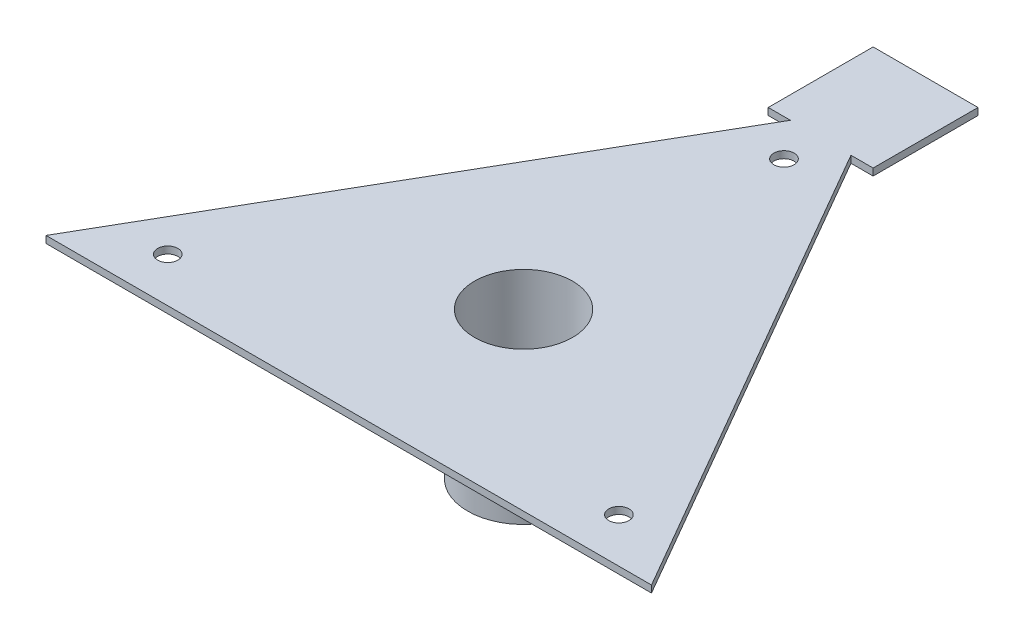
ISO-10303-21;
HEADER;
FILE_DESCRIPTION(('STEP AP214'),'2;1');
FILE_NAME('part.step','',(''),(''),'','','');
FILE_SCHEMA(('AUTOMOTIVE_DESIGN { 1 0 10303 214 1 1 1 1 }'));
ENDSEC;
DATA;
#1=APPLICATION_CONTEXT('core data for automotive mechanical design processes');
#2=APPLICATION_PROTOCOL_DEFINITION('international standard','automotive_design',2000,#1);
#3=PRODUCT_CONTEXT('',#1,'mechanical');
#4=PRODUCT('Part','Part','',(#3));
#5=PRODUCT_RELATED_PRODUCT_CATEGORY('part','',(#4));
#6=PRODUCT_DEFINITION_FORMATION('','',#4);
#7=PRODUCT_DEFINITION_CONTEXT('part definition',#1,'design');
#8=PRODUCT_DEFINITION('design','',#6,#7);
#9=PRODUCT_DEFINITION_SHAPE('','',#8);
#10=(LENGTH_UNIT() NAMED_UNIT(*) SI_UNIT(.MILLI.,.METRE.));
#11=(NAMED_UNIT(*) PLANE_ANGLE_UNIT() SI_UNIT($,.RADIAN.));
#12=(NAMED_UNIT(*) SI_UNIT($,.STERADIAN.) SOLID_ANGLE_UNIT());
#13=UNCERTAINTY_MEASURE_WITH_UNIT(LENGTH_MEASURE(1.E-05),#10,'distance_accuracy_value','');
#14=(GEOMETRIC_REPRESENTATION_CONTEXT(3) GLOBAL_UNCERTAINTY_ASSIGNED_CONTEXT((#13)) GLOBAL_UNIT_ASSIGNED_CONTEXT((#10,
#11,#12)) REPRESENTATION_CONTEXT('',''));
#15=CARTESIAN_POINT('',(0.,0.,0.));
#16=DIRECTION('',(0.,0.,1.));
#17=DIRECTION('',(1.,0.,0.));
#18=AXIS2_PLACEMENT_3D('',#15,#16,#17);
#19=CARTESIAN_POINT('',(-21.650635094611,1.25,-12.5));
#20=DIRECTION('',(0.866025403784439,0.,0.5));
#21=DIRECTION('',(0.5,0.,-0.866025403784439));
#22=AXIS2_PLACEMENT_3D('',#19,#20,#21);
#23=PLANE('',#22);
#24=DIRECTION('',(-0.5,0.,0.866025403784439));
#25=VECTOR('',#24,1.);
#26=CARTESIAN_POINT('',(-21.650635094611,1.,-12.5));
#27=LINE('',#26,#25);
#28=CARTESIAN_POINT('',(-4.33012701892221,1.,-42.5));
#29=VERTEX_POINT('',#28);
#30=CARTESIAN_POINT('',(-43.3012701892219,1.,25.));
#31=VERTEX_POINT('',#30);
#32=EDGE_CURVE('E170',#29,#31,#27,.T.);
#33=ORIENTED_EDGE('',*,*,#32,.F.);
#34=DIRECTION('',(0.,-1.,0.));
#35=VECTOR('',#34,1.);
#36=CARTESIAN_POINT('',(-4.33012701892221,1.25,-42.5));
#37=LINE('',#36,#35);
#38=CARTESIAN_POINT('',(-4.33012701892221,0.,-42.5));
#39=VERTEX_POINT('',#38);
#40=EDGE_CURVE('E155',#29,#39,#37,.T.);
#41=ORIENTED_EDGE('',*,*,#40,.T.);
#42=DIRECTION('',(-0.5,0.,0.866025403784439));
#43=VECTOR('',#42,1.);
#44=CARTESIAN_POINT('',(-21.650635094611,0.,-12.5));
#45=LINE('',#44,#43);
#46=CARTESIAN_POINT('',(-43.3012701892219,0.,25.));
#47=VERTEX_POINT('',#46);
#48=EDGE_CURVE('E182',#39,#47,#45,.T.);
#49=ORIENTED_EDGE('',*,*,#48,.T.);
#50=DIRECTION('',(0.,-1.,0.));
#51=VECTOR('',#50,1.);
#52=CARTESIAN_POINT('',(-43.3012701892219,1.25,25.));
#53=LINE('',#52,#51);
#54=EDGE_CURVE('E52',#31,#47,#53,.T.);
#55=ORIENTED_EDGE('',*,*,#54,.F.);
#56=EDGE_LOOP('',(#33,#41,#49,#55));
#57=FACE_BOUND('',#56,.T.);
#58=ADVANCED_FACE('F44',(#57),#23,.F.);
#59=CARTESIAN_POINT('',(0.,1.25,25.));
#60=DIRECTION('',(0.,0.,-1.));
#61=DIRECTION('',(-1.,0.,0.));
#62=AXIS2_PLACEMENT_3D('',#59,#60,#61);
#63=PLANE('',#62);
#64=DIRECTION('',(1.,0.,0.));
#65=VECTOR('',#64,1.);
#66=CARTESIAN_POINT('',(0.,1.,25.));
#67=LINE('',#66,#65);
#68=CARTESIAN_POINT('',(43.3012701892219,1.,25.0000000000001));
#69=VERTEX_POINT('',#68);
#70=EDGE_CURVE('E168',#31,#69,#67,.T.);
#71=ORIENTED_EDGE('',*,*,#70,.F.);
#72=ORIENTED_EDGE('',*,*,#54,.T.);
#73=DIRECTION('',(1.,0.,0.));
#74=VECTOR('',#73,1.);
#75=CARTESIAN_POINT('',(0.,0.,25.));
#76=LINE('',#75,#74);
#77=CARTESIAN_POINT('',(43.3012701892219,0.,25.0000000000001));
#78=VERTEX_POINT('',#77);
#79=EDGE_CURVE('E189',#47,#78,#76,.T.);
#80=ORIENTED_EDGE('',*,*,#79,.T.);
#81=DIRECTION('',(0.,-1.,0.));
#82=VECTOR('',#81,1.);
#83=CARTESIAN_POINT('',(43.3012701892219,1.25,25.0000000000001));
#84=LINE('',#83,#82);
#85=EDGE_CURVE('E194',#69,#78,#84,.T.);
#86=ORIENTED_EDGE('',*,*,#85,.F.);
#87=EDGE_LOOP('',(#71,#72,#80,#86));
#88=FACE_BOUND('',#87,.T.);
#89=ADVANCED_FACE('F201',(#88),#63,.F.);
#90=CARTESIAN_POINT('',(21.6506350946109,1.25,-12.5));
#91=DIRECTION('',(0.866025403784439,0.,-0.499999999999999));
#92=DIRECTION('',(-0.499999999999999,0.,-0.866025403784439));
#93=AXIS2_PLACEMENT_3D('',#90,#91,#92);
#94=PLANE('',#93);
#95=DIRECTION('',(0.,-1.,0.));
#96=VECTOR('',#95,1.);
#97=CARTESIAN_POINT('',(4.3301270189222,1.25,-42.5));
#98=LINE('',#97,#96);
#99=CARTESIAN_POINT('',(4.33012701892219,1.,-42.5));
#100=VERTEX_POINT('',#99);
#101=CARTESIAN_POINT('',(4.33012701892219,0.,-42.5));
#102=VERTEX_POINT('',#101);
#103=EDGE_CURVE('E149',#100,#102,#98,.T.);
#104=ORIENTED_EDGE('',*,*,#103,.F.);
#105=DIRECTION('',(0.499999999999999,0.,0.866025403784439));
#106=VECTOR('',#105,1.);
#107=CARTESIAN_POINT('',(21.6506350946109,1.,-12.5));
#108=LINE('',#107,#106);
#109=EDGE_CURVE('E67',#100,#69,#108,.T.);
#110=ORIENTED_EDGE('',*,*,#109,.T.);
#111=ORIENTED_EDGE('',*,*,#85,.T.);
#112=DIRECTION('',(0.499999999999999,0.,0.866025403784439));
#113=VECTOR('',#112,1.);
#114=CARTESIAN_POINT('',(21.6506350946109,0.,-12.5));
#115=LINE('',#114,#113);
#116=EDGE_CURVE('E192',#102,#78,#115,.T.);
#117=ORIENTED_EDGE('',*,*,#116,.F.);
#118=EDGE_LOOP('',(#104,#110,#111,#117));
#119=FACE_BOUND('',#118,.T.);
#120=ADVANCED_FACE('F209',(#119),#94,.T.);
#121=CARTESIAN_POINT('',(32.2594462909703,0.,18.625));
#122=DIRECTION('',(0.,1.,0.));
#123=DIRECTION('',(0.,0.,1.));
#124=AXIS2_PLACEMENT_3D('',#121,#122,#123);
#125=CYLINDRICAL_SURFACE('',#124,1.45);
#126=CARTESIAN_POINT('',(32.2594462909703,0.,18.625));
#127=DIRECTION('',(0.,1.,0.));
#128=DIRECTION('',(0.,0.,1.));
#129=AXIS2_PLACEMENT_3D('',#126,#127,#128);
#130=CIRCLE('',#129,1.45);
#131=CARTESIAN_POINT('',(32.2594462909703,0.,20.075));
#132=VERTEX_POINT('',#131);
#133=EDGE_CURVE('E178',#132,#132,#130,.T.);
#134=ORIENTED_EDGE('',*,*,#133,.F.);
#135=EDGE_LOOP('',(#134));
#136=FACE_BOUND('',#135,.T.);
#137=CARTESIAN_POINT('',(32.2594462909703,1.,18.625));
#138=DIRECTION('',(0.,1.,0.));
#139=DIRECTION('',(0.,0.,1.));
#140=AXIS2_PLACEMENT_3D('',#137,#138,#139);
#141=CIRCLE('',#140,1.45);
#142=CARTESIAN_POINT('',(32.2594462909703,1.,20.075));
#143=VERTEX_POINT('',#142);
#144=EDGE_CURVE('E164',#143,#143,#141,.F.);
#145=ORIENTED_EDGE('',*,*,#144,.F.);
#146=EDGE_LOOP('',(#145));
#147=FACE_BOUND('',#146,.T.);
#148=ADVANCED_FACE('F211',(#136,#147),#125,.F.);
#149=CARTESIAN_POINT('',(-32.2594462909704,0.,18.6249999999998));
#150=DIRECTION('',(0.,1.,0.));
#151=DIRECTION('',(0.,0.,1.));
#152=AXIS2_PLACEMENT_3D('',#149,#150,#151);
#153=CYLINDRICAL_SURFACE('',#152,1.45);
#154=CARTESIAN_POINT('',(-32.2594462909704,0.,18.6249999999998));
#155=DIRECTION('',(0.,1.,0.));
#156=DIRECTION('',(0.,0.,1.));
#157=AXIS2_PLACEMENT_3D('',#154,#155,#156);
#158=CIRCLE('',#157,1.45);
#159=CARTESIAN_POINT('',(-32.2594462909704,0.,20.0749999999998));
#160=VERTEX_POINT('',#159);
#161=EDGE_CURVE('E183',#160,#160,#158,.T.);
#162=ORIENTED_EDGE('',*,*,#161,.F.);
#163=EDGE_LOOP('',(#162));
#164=FACE_BOUND('',#163,.T.);
#165=CARTESIAN_POINT('',(-32.2594462909704,1.,18.6249999999998));
#166=DIRECTION('',(0.,1.,0.));
#167=DIRECTION('',(0.,0.,1.));
#168=AXIS2_PLACEMENT_3D('',#165,#166,#167);
#169=CIRCLE('',#168,1.45);
#170=CARTESIAN_POINT('',(-32.2594462909704,1.,20.0749999999998));
#171=VERTEX_POINT('',#170);
#172=EDGE_CURVE('E161',#171,#171,#169,.F.);
#173=ORIENTED_EDGE('',*,*,#172,.F.);
#174=EDGE_LOOP('',(#173));
#175=FACE_BOUND('',#174,.T.);
#176=ADVANCED_FACE('F218',(#164,#175),#153,.F.);
#177=CARTESIAN_POINT('',(0.,0.,-37.25));
#178=DIRECTION('',(0.,1.,0.));
#179=DIRECTION('',(0.,0.,1.));
#180=AXIS2_PLACEMENT_3D('',#177,#178,#179);
#181=CYLINDRICAL_SURFACE('',#180,1.45);
#182=CARTESIAN_POINT('',(0.,0.,-37.25));
#183=DIRECTION('',(0.,1.,0.));
#184=DIRECTION('',(0.,0.,1.));
#185=AXIS2_PLACEMENT_3D('',#182,#183,#184);
#186=CIRCLE('',#185,1.45);
#187=CARTESIAN_POINT('',(0.,0.,-35.8));
#188=VERTEX_POINT('',#187);
#189=EDGE_CURVE('E179',#188,#188,#186,.T.);
#190=ORIENTED_EDGE('',*,*,#189,.F.);
#191=EDGE_LOOP('',(#190));
#192=FACE_BOUND('',#191,.T.);
#193=CARTESIAN_POINT('',(0.,1.,-37.25));
#194=DIRECTION('',(0.,1.,0.));
#195=DIRECTION('',(0.,0.,1.));
#196=AXIS2_PLACEMENT_3D('',#193,#194,#195);
#197=CIRCLE('',#196,1.45);
#198=CARTESIAN_POINT('',(0.,1.,-35.8));
#199=VERTEX_POINT('',#198);
#200=EDGE_CURVE('E158',#199,#199,#197,.F.);
#201=ORIENTED_EDGE('',*,*,#200,.F.);
#202=EDGE_LOOP('',(#201));
#203=FACE_BOUND('',#202,.T.);
#204=ADVANCED_FACE('F252',(#192,#203),#181,.F.);
#205=CARTESIAN_POINT('',(0.,5.,0.));
#206=DIRECTION('',(0.,-1.,0.));
#207=DIRECTION('',(0.,0.,-1.));
#208=AXIS2_PLACEMENT_3D('',#205,#206,#207);
#209=CYLINDRICAL_SURFACE('',#208,7.);
#210=CARTESIAN_POINT('',(0.,-20.,0.));
#211=DIRECTION('',(0.,-1.,0.));
#212=DIRECTION('',(0.,0.,-1.));
#213=AXIS2_PLACEMENT_3D('',#210,#211,#212);
#214=CIRCLE('',#213,7.);
#215=CARTESIAN_POINT('',(0.,-20.,-7.));
#216=VERTEX_POINT('',#215);
#217=EDGE_CURVE('E172',#216,#216,#214,.T.);
#218=ORIENTED_EDGE('',*,*,#217,.T.);
#219=EDGE_LOOP('',(#218));
#220=FACE_BOUND('',#219,.T.);
#221=CARTESIAN_POINT('',(0.,1.,0.));
#222=DIRECTION('',(0.,1.,0.));
#223=DIRECTION('',(0.,0.,1.));
#224=AXIS2_PLACEMENT_3D('',#221,#222,#223);
#225=CIRCLE('',#224,7.);
#226=CARTESIAN_POINT('',(0.,1.,7.));
#227=VERTEX_POINT('',#226);
#228=EDGE_CURVE('E47',#227,#227,#225,.F.);
#229=ORIENTED_EDGE('',*,*,#228,.F.);
#230=EDGE_LOOP('',(#229));
#231=FACE_BOUND('',#230,.T.);
#232=ADVANCED_FACE('F250',(#220,#231),#209,.F.);
#233=CARTESIAN_POINT('',(0.,0.,0.));
#234=DIRECTION('',(0.,1.,0.));
#235=DIRECTION('',(0.,0.,1.));
#236=AXIS2_PLACEMENT_3D('',#233,#234,#235);
#237=PLANE('',#236);
#238=ORIENTED_EDGE('',*,*,#48,.F.);
#239=DIRECTION('',(-1.,0.,0.));
#240=VECTOR('',#239,1.);
#241=CARTESIAN_POINT('',(-7.50000000000001,0.,-42.5));
#242=LINE('',#241,#240);
#243=CARTESIAN_POINT('',(-7.50000000000001,0.,-42.5));
#244=VERTEX_POINT('',#243);
#245=EDGE_CURVE('E144',#39,#244,#242,.T.);
#246=ORIENTED_EDGE('',*,*,#245,.T.);
#247=DIRECTION('',(0.,0.,-1.));
#248=VECTOR('',#247,1.);
#249=CARTESIAN_POINT('',(-7.50000000000001,0.,-57.5));
#250=LINE('',#249,#248);
#251=CARTESIAN_POINT('',(-7.50000000000001,0.,-57.5));
#252=VERTEX_POINT('',#251);
#253=EDGE_CURVE('E136',#244,#252,#250,.T.);
#254=ORIENTED_EDGE('',*,*,#253,.T.);
#255=DIRECTION('',(1.,0.,0.));
#256=VECTOR('',#255,1.);
#257=CARTESIAN_POINT('',(-7.50000000000001,0.,-57.5));
#258=LINE('',#257,#256);
#259=CARTESIAN_POINT('',(7.49999999999999,0.,-57.5));
#260=VERTEX_POINT('',#259);
#261=EDGE_CURVE('E133',#252,#260,#258,.T.);
#262=ORIENTED_EDGE('',*,*,#261,.T.);
#263=DIRECTION('',(0.,0.,1.));
#264=VECTOR('',#263,1.);
#265=CARTESIAN_POINT('',(7.49999999999999,0.,-57.5));
#266=LINE('',#265,#264);
#267=CARTESIAN_POINT('',(7.49999999999999,0.,-42.5));
#268=VERTEX_POINT('',#267);
#269=EDGE_CURVE('E142',#260,#268,#266,.T.);
#270=ORIENTED_EDGE('',*,*,#269,.T.);
#271=EDGE_CURVE('E59',#268,#102,#242,.T.);
#272=ORIENTED_EDGE('',*,*,#271,.T.);
#273=ORIENTED_EDGE('',*,*,#116,.T.);
#274=ORIENTED_EDGE('',*,*,#79,.F.);
#275=EDGE_LOOP('',(#238,#246,#254,#262,#270,#272,#273,#274));
#276=FACE_BOUND('',#275,.T.);
#277=CARTESIAN_POINT('',(0.,0.,0.));
#278=DIRECTION('',(0.,1.,0.));
#279=DIRECTION('',(0.,0.,1.));
#280=AXIS2_PLACEMENT_3D('',#277,#278,#279);
#281=CIRCLE('',#280,8.);
#282=CARTESIAN_POINT('',(0.,0.,8.));
#283=VERTEX_POINT('',#282);
#284=EDGE_CURVE('E11',#283,#283,#281,.F.);
#285=ORIENTED_EDGE('',*,*,#284,.F.);
#286=EDGE_LOOP('',(#285));
#287=FACE_BOUND('',#286,.T.);
#288=ORIENTED_EDGE('',*,*,#189,.T.);
#289=EDGE_LOOP('',(#288));
#290=FACE_BOUND('',#289,.T.);
#291=ORIENTED_EDGE('',*,*,#161,.T.);
#292=EDGE_LOOP('',(#291));
#293=FACE_BOUND('',#292,.T.);
#294=ORIENTED_EDGE('',*,*,#133,.T.);
#295=EDGE_LOOP('',(#294));
#296=FACE_BOUND('',#295,.T.);
#297=ADVANCED_FACE('F206',(#276,#287,#290,#293,#296),#237,.F.);
#298=CARTESIAN_POINT('',(0.,-20.,0.));
#299=DIRECTION('',(0.,1.,0.));
#300=DIRECTION('',(0.,0.,1.));
#301=AXIS2_PLACEMENT_3D('',#298,#299,#300);
#302=CYLINDRICAL_SURFACE('',#301,8.);
#303=CARTESIAN_POINT('',(0.,-20.,0.));
#304=DIRECTION('',(0.,-1.,0.));
#305=DIRECTION('',(0.,0.,-1.));
#306=AXIS2_PLACEMENT_3D('',#303,#304,#305);
#307=CIRCLE('',#306,8.);
#308=CARTESIAN_POINT('',(0.,-20.,-8.));
#309=VERTEX_POINT('',#308);
#310=EDGE_CURVE('E175',#309,#309,#307,.T.);
#311=ORIENTED_EDGE('',*,*,#310,.F.);
#312=EDGE_LOOP('',(#311));
#313=FACE_BOUND('',#312,.T.);
#314=ORIENTED_EDGE('',*,*,#284,.T.);
#315=EDGE_LOOP('',(#314));
#316=FACE_BOUND('',#315,.T.);
#317=ADVANCED_FACE('F256',(#313,#316),#302,.T.);
#318=CARTESIAN_POINT('',(0.,-20.,0.));
#319=DIRECTION('',(0.,-1.,0.));
#320=DIRECTION('',(0.,0.,-1.));
#321=AXIS2_PLACEMENT_3D('',#318,#319,#320);
#322=PLANE('',#321);
#323=ORIENTED_EDGE('',*,*,#217,.F.);
#324=EDGE_LOOP('',(#323));
#325=FACE_BOUND('',#324,.T.);
#326=ORIENTED_EDGE('',*,*,#310,.T.);
#327=EDGE_LOOP('',(#326));
#328=FACE_BOUND('',#327,.T.);
#329=ADVANCED_FACE('F249',(#325,#328),#322,.T.);
#330=CARTESIAN_POINT('',(0.,1.,0.));
#331=DIRECTION('',(0.,1.,0.));
#332=DIRECTION('',(0.,0.,1.));
#333=AXIS2_PLACEMENT_3D('',#330,#331,#332);
#334=PLANE('',#333);
#335=DIRECTION('',(-1.,0.,0.));
#336=VECTOR('',#335,1.);
#337=CARTESIAN_POINT('',(-7.50000000000001,1.,-42.5));
#338=LINE('',#337,#336);
#339=CARTESIAN_POINT('',(-7.50000000000001,1.,-42.5));
#340=VERTEX_POINT('',#339);
#341=EDGE_CURVE('E129',#29,#340,#338,.T.);
#342=ORIENTED_EDGE('',*,*,#341,.F.);
#343=ORIENTED_EDGE('',*,*,#32,.T.);
#344=ORIENTED_EDGE('',*,*,#70,.T.);
#345=ORIENTED_EDGE('',*,*,#109,.F.);
#346=CARTESIAN_POINT('',(7.49999999999999,1.,-42.5));
#347=VERTEX_POINT('',#346);
#348=EDGE_CURVE('E113',#347,#100,#338,.T.);
#349=ORIENTED_EDGE('',*,*,#348,.F.);
#350=DIRECTION('',(0.,0.,1.));
#351=VECTOR('',#350,1.);
#352=CARTESIAN_POINT('',(7.49999999999999,1.,-57.5));
#353=LINE('',#352,#351);
#354=CARTESIAN_POINT('',(7.49999999999999,1.,-57.5));
#355=VERTEX_POINT('',#354);
#356=EDGE_CURVE('E126',#355,#347,#353,.T.);
#357=ORIENTED_EDGE('',*,*,#356,.F.);
#358=DIRECTION('',(1.,0.,0.));
#359=VECTOR('',#358,1.);
#360=CARTESIAN_POINT('',(-7.50000000000001,1.,-57.5));
#361=LINE('',#360,#359);
#362=CARTESIAN_POINT('',(-7.50000000000001,1.,-57.5));
#363=VERTEX_POINT('',#362);
#364=EDGE_CURVE('E118',#363,#355,#361,.T.);
#365=ORIENTED_EDGE('',*,*,#364,.F.);
#366=DIRECTION('',(0.,0.,-1.));
#367=VECTOR('',#366,1.);
#368=CARTESIAN_POINT('',(-7.50000000000001,1.,-57.5));
#369=LINE('',#368,#367);
#370=EDGE_CURVE('E128',#340,#363,#369,.T.);
#371=ORIENTED_EDGE('',*,*,#370,.F.);
#372=EDGE_LOOP('',(#342,#343,#344,#345,#349,#357,#365,#371));
#373=FACE_BOUND('',#372,.T.);
#374=ORIENTED_EDGE('',*,*,#144,.T.);
#375=EDGE_LOOP('',(#374));
#376=FACE_BOUND('',#375,.T.);
#377=ORIENTED_EDGE('',*,*,#172,.T.);
#378=EDGE_LOOP('',(#377));
#379=FACE_BOUND('',#378,.T.);
#380=ORIENTED_EDGE('',*,*,#200,.T.);
#381=EDGE_LOOP('',(#380));
#382=FACE_BOUND('',#381,.T.);
#383=ORIENTED_EDGE('',*,*,#228,.T.);
#384=EDGE_LOOP('',(#383));
#385=FACE_BOUND('',#384,.T.);
#386=ADVANCED_FACE('F123',(#373,#376,#379,#382,#385),#334,.T.);
#387=CARTESIAN_POINT('',(-7.50000000000001,1.,-42.5));
#388=DIRECTION('',(0.,0.,1.));
#389=DIRECTION('',(1.,0.,0.));
#390=AXIS2_PLACEMENT_3D('',#387,#388,#389);
#391=PLANE('',#390);
#392=ORIENTED_EDGE('',*,*,#40,.F.);
#393=ORIENTED_EDGE('',*,*,#341,.T.);
#394=DIRECTION('',(0.,-1.,0.));
#395=VECTOR('',#394,1.);
#396=CARTESIAN_POINT('',(-7.50000000000001,1.,-42.5));
#397=LINE('',#396,#395);
#398=EDGE_CURVE('E117',#340,#244,#397,.T.);
#399=ORIENTED_EDGE('',*,*,#398,.T.);
#400=ORIENTED_EDGE('',*,*,#245,.F.);
#401=EDGE_LOOP('',(#392,#393,#399,#400));
#402=FACE_BOUND('',#401,.T.);
#403=ADVANCED_FACE('F229',(#402),#391,.T.);
#404=CARTESIAN_POINT('',(7.49999999999999,1.,-57.5));
#405=DIRECTION('',(1.,0.,0.));
#406=DIRECTION('',(0.,0.,-1.));
#407=AXIS2_PLACEMENT_3D('',#404,#405,#406);
#408=PLANE('',#407);
#409=ORIENTED_EDGE('',*,*,#269,.F.);
#410=DIRECTION('',(0.,-1.,0.));
#411=VECTOR('',#410,1.);
#412=CARTESIAN_POINT('',(7.49999999999999,1.,-57.5));
#413=LINE('',#412,#411);
#414=EDGE_CURVE('E132',#355,#260,#413,.T.);
#415=ORIENTED_EDGE('',*,*,#414,.F.);
#416=ORIENTED_EDGE('',*,*,#356,.T.);
#417=DIRECTION('',(0.,-1.,0.));
#418=VECTOR('',#417,1.);
#419=CARTESIAN_POINT('',(7.49999999999999,1.,-42.5));
#420=LINE('',#419,#418);
#421=EDGE_CURVE('E110',#347,#268,#420,.T.);
#422=ORIENTED_EDGE('',*,*,#421,.T.);
#423=EDGE_LOOP('',(#409,#415,#416,#422));
#424=FACE_BOUND('',#423,.T.);
#425=ADVANCED_FACE('F131',(#424),#408,.T.);
#426=CARTESIAN_POINT('',(-7.50000000000001,1.,-57.5));
#427=DIRECTION('',(0.,0.,-1.));
#428=DIRECTION('',(-1.,0.,0.));
#429=AXIS2_PLACEMENT_3D('',#426,#427,#428);
#430=PLANE('',#429);
#431=ORIENTED_EDGE('',*,*,#261,.F.);
#432=DIRECTION('',(0.,-1.,0.));
#433=VECTOR('',#432,1.);
#434=CARTESIAN_POINT('',(-7.50000000000001,1.,-57.5));
#435=LINE('',#434,#433);
#436=EDGE_CURVE('E150',#363,#252,#435,.T.);
#437=ORIENTED_EDGE('',*,*,#436,.F.);
#438=ORIENTED_EDGE('',*,*,#364,.T.);
#439=ORIENTED_EDGE('',*,*,#414,.T.);
#440=EDGE_LOOP('',(#431,#437,#438,#439));
#441=FACE_BOUND('',#440,.T.);
#442=ADVANCED_FACE('F235',(#441),#430,.T.);
#443=CARTESIAN_POINT('',(-7.50000000000001,1.,-57.5));
#444=DIRECTION('',(-1.,0.,0.));
#445=DIRECTION('',(0.,0.,1.));
#446=AXIS2_PLACEMENT_3D('',#443,#444,#445);
#447=PLANE('',#446);
#448=ORIENTED_EDGE('',*,*,#253,.F.);
#449=ORIENTED_EDGE('',*,*,#398,.F.);
#450=ORIENTED_EDGE('',*,*,#370,.T.);
#451=ORIENTED_EDGE('',*,*,#436,.T.);
#452=EDGE_LOOP('',(#448,#449,#450,#451));
#453=FACE_BOUND('',#452,.T.);
#454=ADVANCED_FACE('F232',(#453),#447,.T.);
#455=ORIENTED_EDGE('',*,*,#348,.T.);
#456=ORIENTED_EDGE('',*,*,#103,.T.);
#457=ORIENTED_EDGE('',*,*,#271,.F.);
#458=ORIENTED_EDGE('',*,*,#421,.F.);
#459=EDGE_LOOP('',(#455,#456,#457,#458));
#460=FACE_BOUND('',#459,.T.);
#461=ADVANCED_FACE('F112',(#460),#391,.T.);
#462=CLOSED_SHELL('',(#58,#89,#120,#148,#176,#204,#232,#297,#317,#329,#386,#403,#425,#442,#454,#461));
#463=MANIFOLD_SOLID_BREP('B2',#462);
#464=ADVANCED_BREP_SHAPE_REPRESENTATION('',(#18,#463),#14);
#465=SHAPE_DEFINITION_REPRESENTATION(#9,#464);
ENDSEC;
END-ISO-10303-21;
